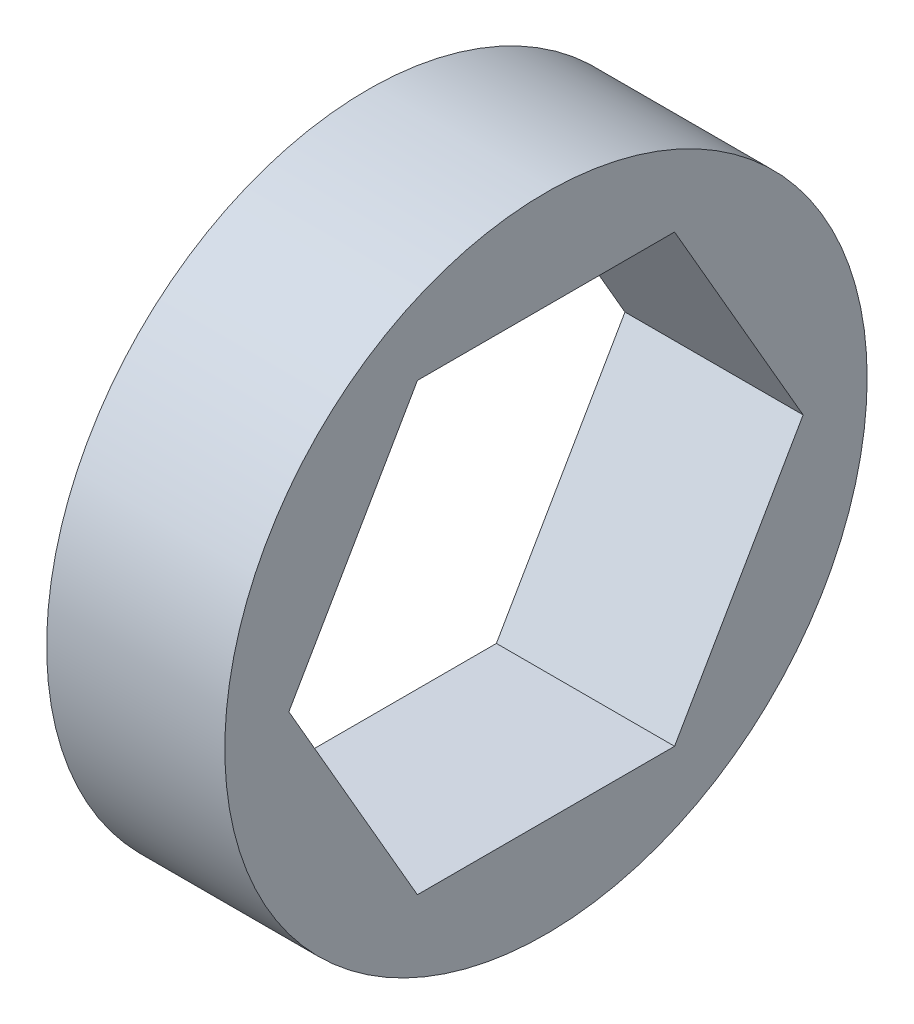
ISO-10303-21;
HEADER;
FILE_DESCRIPTION(('STEP AP214'),'2;1');
FILE_NAME('part.step','',(''),(''),'','','');
FILE_SCHEMA(('AUTOMOTIVE_DESIGN { 1 0 10303 214 1 1 1 1 }'));
ENDSEC;
DATA;
#1=APPLICATION_CONTEXT('core data for automotive mechanical design processes');
#2=APPLICATION_PROTOCOL_DEFINITION('international standard','automotive_design',2000,#1);
#3=PRODUCT_CONTEXT('',#1,'mechanical');
#4=PRODUCT('Part','Part','',(#3));
#5=PRODUCT_RELATED_PRODUCT_CATEGORY('part','',(#4));
#6=PRODUCT_DEFINITION_FORMATION('','',#4);
#7=PRODUCT_DEFINITION_CONTEXT('part definition',#1,'design');
#8=PRODUCT_DEFINITION('design','',#6,#7);
#9=PRODUCT_DEFINITION_SHAPE('','',#8);
#10=(LENGTH_UNIT() NAMED_UNIT(*) SI_UNIT(.MILLI.,.METRE.));
#11=(NAMED_UNIT(*) PLANE_ANGLE_UNIT() SI_UNIT($,.RADIAN.));
#12=(NAMED_UNIT(*) SI_UNIT($,.STERADIAN.) SOLID_ANGLE_UNIT());
#13=UNCERTAINTY_MEASURE_WITH_UNIT(LENGTH_MEASURE(1.E-05),#10,'distance_accuracy_value','');
#14=(GEOMETRIC_REPRESENTATION_CONTEXT(3) GLOBAL_UNCERTAINTY_ASSIGNED_CONTEXT((#13)) GLOBAL_UNIT_ASSIGNED_CONTEXT((#10,
#11,#12)) REPRESENTATION_CONTEXT('',''));
#15=CARTESIAN_POINT('',(0.,0.,0.));
#16=DIRECTION('',(0.,0.,1.));
#17=DIRECTION('',(1.,0.,0.));
#18=AXIS2_PLACEMENT_3D('',#15,#16,#17);
#19=CARTESIAN_POINT('',(5.2832,0.,0.));
#20=DIRECTION('',(1.,0.,0.));
#21=DIRECTION('',(0.,0.,-1.));
#22=AXIS2_PLACEMENT_3D('',#19,#20,#21);
#23=PLANE('',#22);
#24=CARTESIAN_POINT('',(5.2832,0.,0.));
#25=DIRECTION('',(1.,0.,0.));
#26=DIRECTION('',(0.,0.,-1.));
#27=AXIS2_PLACEMENT_3D('',#24,#25,#26);
#28=CIRCLE('',#27,9.525);
#29=CARTESIAN_POINT('',(5.2832,0.,-9.525));
#30=VERTEX_POINT('',#29);
#31=EDGE_CURVE('E11',#30,#30,#28,.T.);
#32=ORIENTED_EDGE('',*,*,#31,.T.);
#33=EDGE_LOOP('',(#32));
#34=FACE_BOUND('',#33,.T.);
#35=DIRECTION('',(0.,0.866025403784439,0.5));
#36=VECTOR('',#35,1.);
#37=CARTESIAN_POINT('',(5.2832,0.,-7.62564235545658));
#38=LINE('',#37,#36);
#39=CARTESIAN_POINT('',(5.2832,0.,-7.62564235545658));
#40=VERTEX_POINT('',#39);
#41=CARTESIAN_POINT('',(5.2832,6.604,-3.81282117772828));
#42=VERTEX_POINT('',#41);
#43=EDGE_CURVE('E94',#40,#42,#38,.T.);
#44=ORIENTED_EDGE('',*,*,#43,.F.);
#45=DIRECTION('',(0.,0.866025403784439,-0.5));
#46=VECTOR('',#45,1.);
#47=CARTESIAN_POINT('',(5.2832,-6.604,-3.81282117772829));
#48=LINE('',#47,#46);
#49=CARTESIAN_POINT('',(5.2832,-6.604,-3.81282117772829));
#50=VERTEX_POINT('',#49);
#51=EDGE_CURVE('E86',#50,#40,#48,.T.);
#52=ORIENTED_EDGE('',*,*,#51,.F.);
#53=DIRECTION('',(0.,0.,-1.));
#54=VECTOR('',#53,1.);
#55=CARTESIAN_POINT('',(5.2832,-6.604,3.81282117772829));
#56=LINE('',#55,#54);
#57=CARTESIAN_POINT('',(5.2832,-6.604,3.81282117772829));
#58=VERTEX_POINT('',#57);
#59=EDGE_CURVE('E114',#58,#50,#56,.T.);
#60=ORIENTED_EDGE('',*,*,#59,.F.);
#61=DIRECTION('',(0.,-0.866025403784439,-0.5));
#62=VECTOR('',#61,1.);
#63=CARTESIAN_POINT('',(5.2832,0.,7.62564235545658));
#64=LINE('',#63,#62);
#65=CARTESIAN_POINT('',(5.2832,0.,7.62564235545658));
#66=VERTEX_POINT('',#65);
#67=EDGE_CURVE('E112',#66,#58,#64,.T.);
#68=ORIENTED_EDGE('',*,*,#67,.F.);
#69=DIRECTION('',(0.,-0.866025403784439,0.5));
#70=VECTOR('',#69,1.);
#71=CARTESIAN_POINT('',(5.2832,6.604,3.81282117772829));
#72=LINE('',#71,#70);
#73=CARTESIAN_POINT('',(5.2832,6.604,3.81282117772829));
#74=VERTEX_POINT('',#73);
#75=EDGE_CURVE('E108',#74,#66,#72,.T.);
#76=ORIENTED_EDGE('',*,*,#75,.F.);
#77=DIRECTION('',(0.,0.,1.));
#78=VECTOR('',#77,1.);
#79=CARTESIAN_POINT('',(5.2832,6.604,-3.81282117772828));
#80=LINE('',#79,#78);
#81=EDGE_CURVE('E106',#42,#74,#80,.T.);
#82=ORIENTED_EDGE('',*,*,#81,.F.);
#83=EDGE_LOOP('',(#44,#52,#60,#68,#76,#82));
#84=FACE_BOUND('',#83,.T.);
#85=ADVANCED_FACE('F33',(#34,#84),#23,.T.);
#86=CARTESIAN_POINT('',(0.,0.,0.));
#87=DIRECTION('',(1.,0.,0.));
#88=DIRECTION('',(0.,0.,-1.));
#89=AXIS2_PLACEMENT_3D('',#86,#87,#88);
#90=PLANE('',#89);
#91=CARTESIAN_POINT('',(0.,0.,0.));
#92=DIRECTION('',(1.,0.,0.));
#93=DIRECTION('',(0.,0.,-1.));
#94=AXIS2_PLACEMENT_3D('',#91,#92,#93);
#95=CIRCLE('',#94,9.525);
#96=CARTESIAN_POINT('',(0.,0.,-9.525));
#97=VERTEX_POINT('',#96);
#98=EDGE_CURVE('E37',#97,#97,#95,.T.);
#99=ORIENTED_EDGE('',*,*,#98,.F.);
#100=EDGE_LOOP('',(#99));
#101=FACE_BOUND('',#100,.T.);
#102=DIRECTION('',(0.,0.866025403784439,-0.5));
#103=VECTOR('',#102,1.);
#104=CARTESIAN_POINT('',(0.,-6.604,-3.81282117772829));
#105=LINE('',#104,#103);
#106=CARTESIAN_POINT('',(0.,-6.604,-3.81282117772829));
#107=VERTEX_POINT('',#106);
#108=CARTESIAN_POINT('',(0.,0.,-7.62564235545658));
#109=VERTEX_POINT('',#108);
#110=EDGE_CURVE('E56',#107,#109,#105,.T.);
#111=ORIENTED_EDGE('',*,*,#110,.T.);
#112=DIRECTION('',(0.,0.866025403784439,0.5));
#113=VECTOR('',#112,1.);
#114=CARTESIAN_POINT('',(0.,0.,-7.62564235545658));
#115=LINE('',#114,#113);
#116=CARTESIAN_POINT('',(0.,6.604,-3.81282117772828));
#117=VERTEX_POINT('',#116);
#118=EDGE_CURVE('E101',#109,#117,#115,.T.);
#119=ORIENTED_EDGE('',*,*,#118,.T.);
#120=DIRECTION('',(0.,0.,1.));
#121=VECTOR('',#120,1.);
#122=CARTESIAN_POINT('',(0.,6.604,-3.81282117772828));
#123=LINE('',#122,#121);
#124=CARTESIAN_POINT('',(0.,6.604,3.81282117772829));
#125=VERTEX_POINT('',#124);
#126=EDGE_CURVE('E118',#117,#125,#123,.T.);
#127=ORIENTED_EDGE('',*,*,#126,.T.);
#128=DIRECTION('',(0.,-0.866025403784439,0.5));
#129=VECTOR('',#128,1.);
#130=CARTESIAN_POINT('',(0.,6.604,3.81282117772829));
#131=LINE('',#130,#129);
#132=CARTESIAN_POINT('',(0.,0.,7.62564235545658));
#133=VERTEX_POINT('',#132);
#134=EDGE_CURVE('E121',#125,#133,#131,.T.);
#135=ORIENTED_EDGE('',*,*,#134,.T.);
#136=DIRECTION('',(0.,-0.866025403784439,-0.5));
#137=VECTOR('',#136,1.);
#138=CARTESIAN_POINT('',(0.,0.,7.62564235545658));
#139=LINE('',#138,#137);
#140=CARTESIAN_POINT('',(0.,-6.604,3.81282117772829));
#141=VERTEX_POINT('',#140);
#142=EDGE_CURVE('E124',#133,#141,#139,.T.);
#143=ORIENTED_EDGE('',*,*,#142,.T.);
#144=DIRECTION('',(0.,0.,-1.));
#145=VECTOR('',#144,1.);
#146=CARTESIAN_POINT('',(0.,-6.604,3.81282117772829));
#147=LINE('',#146,#145);
#148=EDGE_CURVE('E95',#141,#107,#147,.T.);
#149=ORIENTED_EDGE('',*,*,#148,.T.);
#150=EDGE_LOOP('',(#111,#119,#127,#135,#143,#149));
#151=FACE_BOUND('',#150,.T.);
#152=ADVANCED_FACE('F141',(#101,#151),#90,.F.);
#153=CARTESIAN_POINT('',(5.2832,0.,0.));
#154=DIRECTION('',(-1.,0.,0.));
#155=DIRECTION('',(0.,0.,1.));
#156=AXIS2_PLACEMENT_3D('',#153,#154,#155);
#157=CYLINDRICAL_SURFACE('',#156,9.525);
#158=ORIENTED_EDGE('',*,*,#31,.F.);
#159=EDGE_LOOP('',(#158));
#160=FACE_BOUND('',#159,.T.);
#161=ORIENTED_EDGE('',*,*,#98,.T.);
#162=EDGE_LOOP('',(#161));
#163=FACE_BOUND('',#162,.T.);
#164=ADVANCED_FACE('F35',(#160,#163),#157,.T.);
#165=CARTESIAN_POINT('',(5.2832,-6.604,-3.81282117772829));
#166=DIRECTION('',(0.,0.5,0.866025403784439));
#167=DIRECTION('',(0.,-0.866025403784439,0.5));
#168=AXIS2_PLACEMENT_3D('',#165,#166,#167);
#169=PLANE('',#168);
#170=ORIENTED_EDGE('',*,*,#110,.F.);
#171=DIRECTION('',(-1.,0.,0.));
#172=VECTOR('',#171,1.);
#173=CARTESIAN_POINT('',(5.2832,-6.604,-3.81282117772829));
#174=LINE('',#173,#172);
#175=EDGE_CURVE('E90',#50,#107,#174,.T.);
#176=ORIENTED_EDGE('',*,*,#175,.F.);
#177=ORIENTED_EDGE('',*,*,#51,.T.);
#178=DIRECTION('',(-1.,0.,0.));
#179=VECTOR('',#178,1.);
#180=CARTESIAN_POINT('',(5.2832,0.,-7.62564235545658));
#181=LINE('',#180,#179);
#182=EDGE_CURVE('E89',#40,#109,#181,.T.);
#183=ORIENTED_EDGE('',*,*,#182,.T.);
#184=EDGE_LOOP('',(#170,#176,#177,#183));
#185=FACE_BOUND('',#184,.T.);
#186=ADVANCED_FACE('F88',(#185),#169,.T.);
#187=CARTESIAN_POINT('',(5.2832,0.,-7.62564235545658));
#188=DIRECTION('',(0.,-0.5,0.866025403784439));
#189=DIRECTION('',(0.,-0.866025403784439,-0.5));
#190=AXIS2_PLACEMENT_3D('',#187,#188,#189);
#191=PLANE('',#190);
#192=ORIENTED_EDGE('',*,*,#118,.F.);
#193=ORIENTED_EDGE('',*,*,#182,.F.);
#194=ORIENTED_EDGE('',*,*,#43,.T.);
#195=DIRECTION('',(-1.,0.,0.));
#196=VECTOR('',#195,1.);
#197=CARTESIAN_POINT('',(5.2832,6.604,-3.81282117772828));
#198=LINE('',#197,#196);
#199=EDGE_CURVE('E102',#42,#117,#198,.T.);
#200=ORIENTED_EDGE('',*,*,#199,.T.);
#201=EDGE_LOOP('',(#192,#193,#194,#200));
#202=FACE_BOUND('',#201,.T.);
#203=ADVANCED_FACE('F98',(#202),#191,.T.);
#204=CARTESIAN_POINT('',(5.2832,6.604,-3.81282117772828));
#205=DIRECTION('',(0.,-1.,0.));
#206=DIRECTION('',(0.,0.,-1.));
#207=AXIS2_PLACEMENT_3D('',#204,#205,#206);
#208=PLANE('',#207);
#209=ORIENTED_EDGE('',*,*,#126,.F.);
#210=ORIENTED_EDGE('',*,*,#199,.F.);
#211=ORIENTED_EDGE('',*,*,#81,.T.);
#212=DIRECTION('',(-1.,0.,0.));
#213=VECTOR('',#212,1.);
#214=CARTESIAN_POINT('',(5.2832,6.604,3.81282117772829));
#215=LINE('',#214,#213);
#216=EDGE_CURVE('E133',#74,#125,#215,.T.);
#217=ORIENTED_EDGE('',*,*,#216,.T.);
#218=EDGE_LOOP('',(#209,#210,#211,#217));
#219=FACE_BOUND('',#218,.T.);
#220=ADVANCED_FACE('F137',(#219),#208,.T.);
#221=CARTESIAN_POINT('',(5.2832,6.604,3.81282117772829));
#222=DIRECTION('',(0.,-0.5,-0.866025403784439));
#223=DIRECTION('',(0.,0.866025403784439,-0.5));
#224=AXIS2_PLACEMENT_3D('',#221,#222,#223);
#225=PLANE('',#224);
#226=ORIENTED_EDGE('',*,*,#134,.F.);
#227=ORIENTED_EDGE('',*,*,#216,.F.);
#228=ORIENTED_EDGE('',*,*,#75,.T.);
#229=DIRECTION('',(-1.,0.,0.));
#230=VECTOR('',#229,1.);
#231=CARTESIAN_POINT('',(5.2832,0.,7.62564235545658));
#232=LINE('',#231,#230);
#233=EDGE_CURVE('E131',#66,#133,#232,.T.);
#234=ORIENTED_EDGE('',*,*,#233,.T.);
#235=EDGE_LOOP('',(#226,#227,#228,#234));
#236=FACE_BOUND('',#235,.T.);
#237=ADVANCED_FACE('F149',(#236),#225,.T.);
#238=CARTESIAN_POINT('',(5.2832,0.,7.62564235545658));
#239=DIRECTION('',(0.,0.5,-0.866025403784439));
#240=DIRECTION('',(0.,0.866025403784439,0.5));
#241=AXIS2_PLACEMENT_3D('',#238,#239,#240);
#242=PLANE('',#241);
#243=ORIENTED_EDGE('',*,*,#142,.F.);
#244=ORIENTED_EDGE('',*,*,#233,.F.);
#245=ORIENTED_EDGE('',*,*,#67,.T.);
#246=DIRECTION('',(-1.,0.,0.));
#247=VECTOR('',#246,1.);
#248=CARTESIAN_POINT('',(5.2832,-6.604,3.81282117772829));
#249=LINE('',#248,#247);
#250=EDGE_CURVE('E48',#58,#141,#249,.T.);
#251=ORIENTED_EDGE('',*,*,#250,.T.);
#252=EDGE_LOOP('',(#243,#244,#245,#251));
#253=FACE_BOUND('',#252,.T.);
#254=ADVANCED_FACE('F147',(#253),#242,.T.);
#255=CARTESIAN_POINT('',(5.2832,-6.604,3.81282117772829));
#256=DIRECTION('',(0.,1.,0.));
#257=DIRECTION('',(0.,0.,1.));
#258=AXIS2_PLACEMENT_3D('',#255,#256,#257);
#259=PLANE('',#258);
#260=ORIENTED_EDGE('',*,*,#148,.F.);
#261=ORIENTED_EDGE('',*,*,#250,.F.);
#262=ORIENTED_EDGE('',*,*,#59,.T.);
#263=ORIENTED_EDGE('',*,*,#175,.T.);
#264=EDGE_LOOP('',(#260,#261,#262,#263));
#265=FACE_BOUND('',#264,.T.);
#266=ADVANCED_FACE('F143',(#265),#259,.T.);
#267=CLOSED_SHELL('',(#85,#152,#164,#186,#203,#220,#237,#254,#266));
#268=MANIFOLD_SOLID_BREP('B2',#267);
#269=ADVANCED_BREP_SHAPE_REPRESENTATION('',(#18,#268),#14);
#270=SHAPE_DEFINITION_REPRESENTATION(#9,#269);
ENDSEC;
END-ISO-10303-21;
